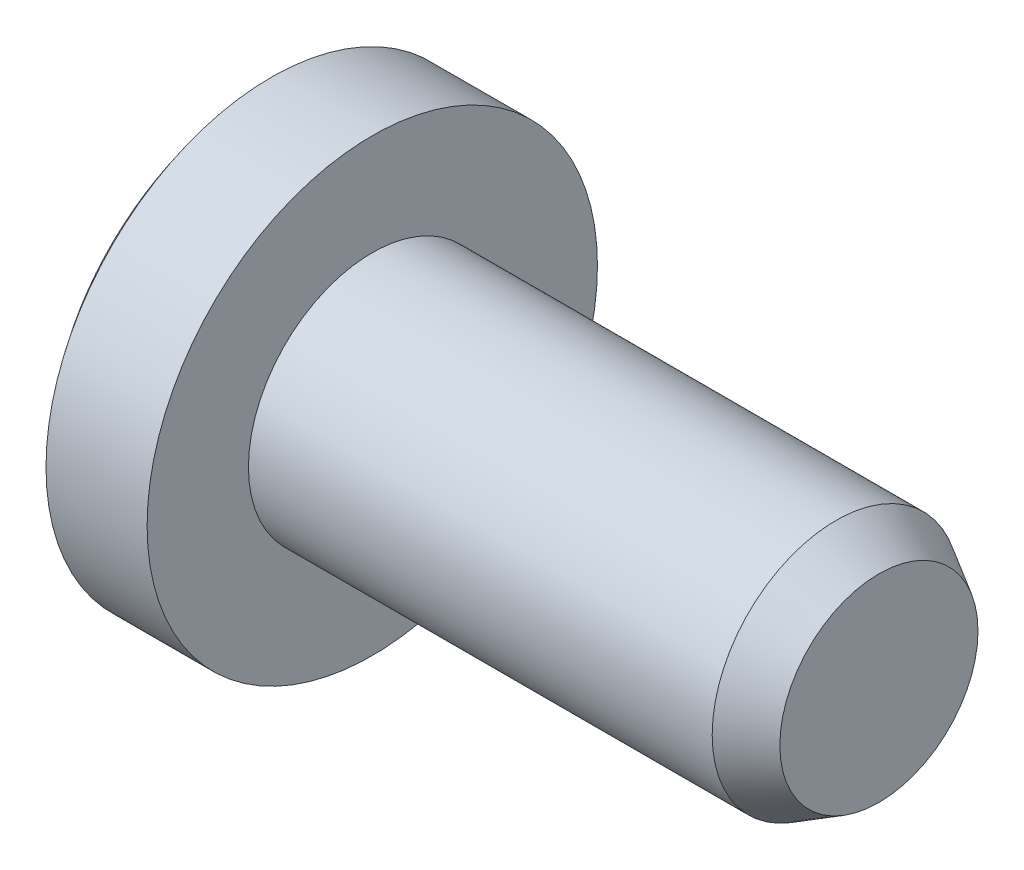
ISO-10303-21;
HEADER;
FILE_DESCRIPTION(('STEP AP214'),'2;1');
FILE_NAME('part.step','',(''),(''),'','','');
FILE_SCHEMA(('AUTOMOTIVE_DESIGN { 1 0 10303 214 1 1 1 1 }'));
ENDSEC;
DATA;
#1=APPLICATION_CONTEXT('core data for automotive mechanical design processes');
#2=APPLICATION_PROTOCOL_DEFINITION('international standard','automotive_design',2000,#1);
#3=PRODUCT_CONTEXT('',#1,'mechanical');
#4=PRODUCT('Part','Part','',(#3));
#5=PRODUCT_RELATED_PRODUCT_CATEGORY('part','',(#4));
#6=PRODUCT_DEFINITION_FORMATION('','',#4);
#7=PRODUCT_DEFINITION_CONTEXT('part definition',#1,'design');
#8=PRODUCT_DEFINITION('design','',#6,#7);
#9=PRODUCT_DEFINITION_SHAPE('','',#8);
#10=(LENGTH_UNIT() NAMED_UNIT(*) SI_UNIT(.MILLI.,.METRE.));
#11=(NAMED_UNIT(*) PLANE_ANGLE_UNIT() SI_UNIT($,.RADIAN.));
#12=(NAMED_UNIT(*) SI_UNIT($,.STERADIAN.) SOLID_ANGLE_UNIT());
#13=UNCERTAINTY_MEASURE_WITH_UNIT(LENGTH_MEASURE(1.E-05),#10,'distance_accuracy_value','');
#14=(GEOMETRIC_REPRESENTATION_CONTEXT(3) GLOBAL_UNCERTAINTY_ASSIGNED_CONTEXT((#13)) GLOBAL_UNIT_ASSIGNED_CONTEXT((#10,
#11,#12)) REPRESENTATION_CONTEXT('',''));
#15=CARTESIAN_POINT('',(0.,0.,0.));
#16=DIRECTION('',(0.,0.,1.));
#17=DIRECTION('',(1.,0.,0.));
#18=AXIS2_PLACEMENT_3D('',#15,#16,#17);
#19=CARTESIAN_POINT('',(1.6,0.,0.));
#20=DIRECTION('',(-1.,0.,0.));
#21=DIRECTION('',(0.,1.,0.));
#22=AXIS2_PLACEMENT_3D('',#19,#20,#21);
#23=SPHERICAL_SURFACE('',#22,3.2);
#24=CARTESIAN_POINT('',(-0.89799919935936,0.,0.));
#25=DIRECTION('',(-1.,0.,0.));
#26=DIRECTION('',(0.,0.,1.));
#27=AXIS2_PLACEMENT_3D('',#24,#25,#26);
#28=CIRCLE('',#27,2.);
#29=CARTESIAN_POINT('',(-0.89799919935936,0.,2.));
#30=VERTEX_POINT('',#29);
#31=EDGE_CURVE('E190',#30,#30,#28,.T.);
#32=ORIENTED_EDGE('',*,*,#31,.T.);
#33=EDGE_LOOP('',(#32));
#34=FACE_BOUND('',#33,.T.);
#35=CARTESIAN_POINT('',(1.56503616117409,0.0806815870157537,0.322726348063015));
#36=DIRECTION('',(0.104528463267654,-0.241206989505462,-0.964827958021851));
#37=DIRECTION('',(0.,0.970142500145332,-0.242535625036333));
#38=AXIS2_PLACEMENT_3D('',#35,#36,#37);
#39=CIRCLE('',#38,3.18247006517848);
#40=CARTESIAN_POINT('',(-1.45274996309991,0.934523397478773,-0.217677932639515));
#41=VERTEX_POINT('',#40);
#42=CARTESIAN_POINT('',(-1.54602165644221,0.569150220513997,-0.136439597205102));
#43=VERTEX_POINT('',#42);
#44=EDGE_CURVE('E11',#41,#43,#39,.F.);
#45=ORIENTED_EDGE('',*,*,#44,.F.);
#46=CARTESIAN_POINT('',(1.66379421431252,0.606961405040141,0.));
#47=DIRECTION('',(0.104528463267654,0.994521895368273,0.));
#48=DIRECTION('',(-0.994521895368273,0.104528463267654,0.));
#49=AXIS2_PLACEMENT_3D('',#46,#47,#48);
#50=CIRCLE('',#49,3.14126219074625);
#51=CARTESIAN_POINT('',(-1.45274996309991,0.934523397478773,0.217677932639514));
#52=VERTEX_POINT('',#51);
#53=EDGE_CURVE('E42',#52,#41,#50,.F.);
#54=ORIENTED_EDGE('',*,*,#53,.F.);
#55=CARTESIAN_POINT('',(1.56503616117409,0.0806815870157537,-0.322726348063015));
#56=DIRECTION('',(0.104528463267654,-0.241206989505462,0.964827958021851));
#57=DIRECTION('',(0.,-0.970142500145332,-0.242535625036333));
#58=AXIS2_PLACEMENT_3D('',#55,#56,#57);
#59=CIRCLE('',#58,3.18247006517848);
#60=CARTESIAN_POINT('',(-1.54602165644221,0.569150220513997,0.136439597205102));
#61=VERTEX_POINT('',#60);
#62=EDGE_CURVE('E326',#61,#52,#59,.F.);
#63=ORIENTED_EDGE('',*,*,#62,.F.);
#64=CARTESIAN_POINT('',(1.60749262454255,0.0356437803082174,0.061736838467657));
#65=DIRECTION('',(0.104528463267654,0.497260947684129,0.861281226008779));
#66=DIRECTION('',(0.,-0.866025403784443,0.499999999999992));
#67=AXIS2_PLACEMENT_3D('',#64,#65,#66);
#68=CIRCLE('',#67,3.19919707806175);
#69=CARTESIAN_POINT('',(-1.57234339721419,0.296847915734236,0.296847915734238));
#70=VERTEX_POINT('',#69);
#71=EDGE_CURVE('E324',#70,#61,#68,.F.);
#72=ORIENTED_EDGE('',*,*,#71,.F.);
#73=CARTESIAN_POINT('',(1.60749262454255,0.061736838467655,0.0356437803082149));
#74=DIRECTION('',(0.104528463267654,0.861281226008787,0.497260947684114));
#75=DIRECTION('',(0.,-0.499999999999977,0.866025403784452));
#76=AXIS2_PLACEMENT_3D('',#73,#74,#75);
#77=CIRCLE('',#76,3.19919707806175);
#78=CARTESIAN_POINT('',(-1.54602165644221,0.136439597205108,0.569150220513995));
#79=VERTEX_POINT('',#78);
#80=EDGE_CURVE('E322',#79,#70,#77,.F.);
#81=ORIENTED_EDGE('',*,*,#80,.F.);
#82=CARTESIAN_POINT('',(1.56503616117409,-0.322726348063014,0.0806815870157571));
#83=DIRECTION('',(0.104528463267654,0.964827958021848,-0.241206989505473));
#84=DIRECTION('',(0.,0.242535625036343,0.970142500145329));
#85=AXIS2_PLACEMENT_3D('',#82,#83,#84);
#86=CIRCLE('',#85,3.18247006517848);
#87=CARTESIAN_POINT('',(-1.45274996309991,0.217677932639524,0.934523397478771));
#88=VERTEX_POINT('',#87);
#89=EDGE_CURVE('E320',#88,#79,#86,.F.);
#90=ORIENTED_EDGE('',*,*,#89,.F.);
#91=CARTESIAN_POINT('',(1.66379421431252,0.,0.606961405040141));
#92=DIRECTION('',(0.104528463267654,0.,0.994521895368273));
#93=DIRECTION('',(0.994521895368273,0.,-0.104528463267654));
#94=AXIS2_PLACEMENT_3D('',#91,#92,#93);
#95=CIRCLE('',#94,3.14126219074625);
#96=CARTESIAN_POINT('',(-1.45274996309991,-0.217677932639505,0.934523397478775));
#97=VERTEX_POINT('',#96);
#98=EDGE_CURVE('E318',#97,#88,#95,.F.);
#99=ORIENTED_EDGE('',*,*,#98,.F.);
#100=CARTESIAN_POINT('',(1.56503616117409,0.322726348063016,0.0806815870157503));
#101=DIRECTION('',(0.104528463267654,-0.964827958021853,-0.241206989505452));
#102=DIRECTION('',(0.,0.242535625036323,-0.970142500145334));
#103=AXIS2_PLACEMENT_3D('',#100,#101,#102);
#104=CIRCLE('',#103,3.18247006517848);
#105=CARTESIAN_POINT('',(-1.54602165644221,-0.136439597205096,0.569150220513998));
#106=VERTEX_POINT('',#105);
#107=EDGE_CURVE('E316',#106,#97,#104,.F.);
#108=ORIENTED_EDGE('',*,*,#107,.F.);
#109=CARTESIAN_POINT('',(1.60749262454255,-0.0617368384676559,0.0356437803082175));
#110=DIRECTION('',(0.104528463267654,-0.861281226008775,0.497260947684136));
#111=DIRECTION('',(0.,-0.499999999999999,-0.866025403784439));
#112=AXIS2_PLACEMENT_3D('',#109,#110,#111);
#113=CIRCLE('',#112,3.19919707806175);
#114=CARTESIAN_POINT('',(-1.57234339721419,-0.296847915734233,0.296847915734241));
#115=VERTEX_POINT('',#114);
#116=EDGE_CURVE('E314',#115,#106,#113,.F.);
#117=ORIENTED_EDGE('',*,*,#116,.F.);
#118=CARTESIAN_POINT('',(1.60749262454255,-0.035643780308217,0.0617368384676573));
#119=DIRECTION('',(0.104528463267654,-0.497260947684123,0.861281226008782));
#120=DIRECTION('',(0.,-0.866025403784447,-0.499999999999986));
#121=AXIS2_PLACEMENT_3D('',#118,#119,#120);
#122=CIRCLE('',#121,3.19919707806175);
#123=CARTESIAN_POINT('',(-1.54602165644221,-0.569150220513996,0.136439597205106));
#124=VERTEX_POINT('',#123);
#125=EDGE_CURVE('E312',#124,#115,#122,.F.);
#126=ORIENTED_EDGE('',*,*,#125,.F.);
#127=CARTESIAN_POINT('',(1.56503616117409,-0.0806815870157559,-0.322726348063015));
#128=DIRECTION('',(0.104528463267654,0.241206989505469,0.964827958021849));
#129=DIRECTION('',(0.,-0.97014250014533,0.242535625036339));
#130=AXIS2_PLACEMENT_3D('',#127,#128,#129);
#131=CIRCLE('',#130,3.18247006517848);
#132=CARTESIAN_POINT('',(-1.45274996309991,-0.934523397478772,0.217677932639521));
#133=VERTEX_POINT('',#132);
#134=EDGE_CURVE('E310',#133,#124,#131,.F.);
#135=ORIENTED_EDGE('',*,*,#134,.F.);
#136=CARTESIAN_POINT('',(1.66379421431252,-0.606961405040141,0.));
#137=DIRECTION('',(0.104528463267654,-0.994521895368273,0.));
#138=DIRECTION('',(0.994521895368273,0.104528463267654,0.));
#139=AXIS2_PLACEMENT_3D('',#136,#137,#138);
#140=CIRCLE('',#139,3.14126219074625);
#141=CARTESIAN_POINT('',(-1.45274996309991,-0.934523397478775,-0.217677932639508));
#142=VERTEX_POINT('',#141);
#143=EDGE_CURVE('E308',#142,#133,#140,.F.);
#144=ORIENTED_EDGE('',*,*,#143,.F.);
#145=CARTESIAN_POINT('',(1.56503616117409,-0.0806815870157514,0.322726348063016));
#146=DIRECTION('',(0.104528463267654,0.241206989505456,-0.964827958021853));
#147=DIRECTION('',(0.,0.970142500145334,0.242535625036326));
#148=AXIS2_PLACEMENT_3D('',#145,#146,#147);
#149=CIRCLE('',#148,3.18247006517848);
#150=CARTESIAN_POINT('',(-1.54602165644221,-0.569150220513998,-0.136439597205098));
#151=VERTEX_POINT('',#150);
#152=EDGE_CURVE('E306',#151,#142,#149,.F.);
#153=ORIENTED_EDGE('',*,*,#152,.F.);
#154=CARTESIAN_POINT('',(1.60749262454255,-0.0356437803082211,-0.0617368384676606));
#155=DIRECTION('',(0.104528463267654,-0.497260947684145,-0.861281226008769));
#156=DIRECTION('',(0.,0.866025403784434,-0.500000000000008));
#157=AXIS2_PLACEMENT_3D('',#154,#155,#156);
#158=CIRCLE('',#157,3.19919707806175);
#159=CARTESIAN_POINT('',(-1.57234339721419,-0.296847915734241,-0.296847915734238));
#160=VERTEX_POINT('',#159);
#161=EDGE_CURVE('E304',#160,#151,#158,.F.);
#162=ORIENTED_EDGE('',*,*,#161,.F.);
#163=CARTESIAN_POINT('',(1.60749262454255,-0.061736838467661,-0.0356437803082204));
#164=DIRECTION('',(0.104528463267654,-0.861281226008775,-0.497260947684136));
#165=DIRECTION('',(0.,0.499999999999999,-0.866025403784439));
#166=AXIS2_PLACEMENT_3D('',#163,#164,#165);
#167=CIRCLE('',#166,3.19919707806175);
#168=CARTESIAN_POINT('',(-1.54602165644221,-0.136439597205104,-0.569150220513996));
#169=VERTEX_POINT('',#168);
#170=EDGE_CURVE('E302',#169,#160,#167,.F.);
#171=ORIENTED_EDGE('',*,*,#170,.F.);
#172=CARTESIAN_POINT('',(1.56503616117409,0.322726348063015,-0.0806815870157548));
#173=DIRECTION('',(0.104528463267654,-0.96482795802185,0.241206989505466));
#174=DIRECTION('',(0.,-0.242535625036336,-0.970142500145331));
#175=AXIS2_PLACEMENT_3D('',#172,#173,#174);
#176=CIRCLE('',#175,3.18247006517848);
#177=CARTESIAN_POINT('',(-1.45274996309991,-0.217677932639518,-0.934523397478772));
#178=VERTEX_POINT('',#177);
#179=EDGE_CURVE('E300',#178,#169,#176,.F.);
#180=ORIENTED_EDGE('',*,*,#179,.F.);
#181=CARTESIAN_POINT('',(1.66379421431252,0.,-0.606961405040141));
#182=DIRECTION('',(0.104528463267654,0.,-0.994521895368273));
#183=DIRECTION('',(-0.994521895368273,0.,-0.104528463267654));
#184=AXIS2_PLACEMENT_3D('',#181,#182,#183);
#185=CIRCLE('',#184,3.14126219074625);
#186=CARTESIAN_POINT('',(-1.45274996309991,0.217677932639511,-0.934523397478774));
#187=VERTEX_POINT('',#186);
#188=EDGE_CURVE('E298',#187,#178,#185,.F.);
#189=ORIENTED_EDGE('',*,*,#188,.F.);
#190=CARTESIAN_POINT('',(1.56503616117409,-0.322726348063015,-0.0806815870157525));
#191=DIRECTION('',(0.104528463267654,0.964827958021852,0.241206989505459));
#192=DIRECTION('',(0.,-0.242535625036329,0.970142500145333));
#193=AXIS2_PLACEMENT_3D('',#190,#191,#192);
#194=CIRCLE('',#193,3.18247006517848);
#195=CARTESIAN_POINT('',(-1.54602165644221,0.1364395972051,-0.569150220513997));
#196=VERTEX_POINT('',#195);
#197=EDGE_CURVE('E296',#196,#187,#194,.F.);
#198=ORIENTED_EDGE('',*,*,#197,.F.);
#199=CARTESIAN_POINT('',(1.60749262454255,0.0617368384676561,-0.035643780308217));
#200=DIRECTION('',(0.104528463267654,0.861281226008778,-0.497260947684129));
#201=DIRECTION('',(0.,0.499999999999993,0.866025403784443));
#202=AXIS2_PLACEMENT_3D('',#199,#200,#201);
#203=CIRCLE('',#202,3.19919707806175);
#204=CARTESIAN_POINT('',(-1.57234339721419,0.296847915734236,-0.296847915734239));
#205=VERTEX_POINT('',#204);
#206=EDGE_CURVE('E294',#205,#196,#203,.F.);
#207=ORIENTED_EDGE('',*,*,#206,.F.);
#208=CARTESIAN_POINT('',(1.60749262454255,0.0356437803082174,-0.061736838467657));
#209=DIRECTION('',(0.104528463267654,0.497260947684129,-0.861281226008779));
#210=DIRECTION('',(0.,0.866025403784443,0.499999999999992));
#211=AXIS2_PLACEMENT_3D('',#208,#209,#210);
#212=CIRCLE('',#211,3.19919707806175);
#213=EDGE_CURVE('E292',#43,#205,#212,.F.);
#214=ORIENTED_EDGE('',*,*,#213,.F.);
#215=EDGE_LOOP('',(#45,#54,#63,#72,#81,#90,#99,#108,#117,#126,#135,#144,#153,#162,#171,#180,
#189,#198,#207,#214));
#216=FACE_BOUND('',#215,.T.);
#217=ADVANCED_FACE('F34',(#34,#216),#23,.T.);
#218=CARTESIAN_POINT('',(0.,1.1,0.));
#219=DIRECTION('',(-1.,0.,0.));
#220=DIRECTION('',(0.,0.,1.));
#221=AXIS2_PLACEMENT_3D('',#218,#219,#220);
#222=PLANE('',#221);
#223=CARTESIAN_POINT('',(0.,0.,0.));
#224=DIRECTION('',(-1.,0.,0.));
#225=DIRECTION('',(0.,0.,1.));
#226=AXIS2_PLACEMENT_3D('',#223,#224,#225);
#227=CIRCLE('',#226,2.);
#228=CARTESIAN_POINT('',(0.,0.,2.));
#229=VERTEX_POINT('',#228);
#230=EDGE_CURVE('E283',#229,#229,#227,.T.);
#231=ORIENTED_EDGE('',*,*,#230,.F.);
#232=EDGE_LOOP('',(#231));
#233=FACE_BOUND('',#232,.T.);
#234=CARTESIAN_POINT('',(0.,0.,0.));
#235=DIRECTION('',(-1.,0.,0.));
#236=DIRECTION('',(0.,0.,1.));
#237=AXIS2_PLACEMENT_3D('',#234,#235,#236);
#238=CIRCLE('',#237,1.1);
#239=CARTESIAN_POINT('',(0.,0.,1.1));
#240=VERTEX_POINT('',#239);
#241=EDGE_CURVE('E186',#240,#240,#238,.T.);
#242=ORIENTED_EDGE('',*,*,#241,.T.);
#243=EDGE_LOOP('',(#242));
#244=FACE_BOUND('',#243,.T.);
#245=ADVANCED_FACE('F422',(#233,#244),#222,.F.);
#246=CARTESIAN_POINT('',(0.,0.,0.));
#247=DIRECTION('',(-1.,0.,0.));
#248=DIRECTION('',(0.,0.,1.));
#249=AXIS2_PLACEMENT_3D('',#246,#247,#248);
#250=CYLINDRICAL_SURFACE('',#249,2.);
#251=ORIENTED_EDGE('',*,*,#31,.F.);
#252=EDGE_LOOP('',(#251));
#253=FACE_BOUND('',#252,.T.);
#254=ORIENTED_EDGE('',*,*,#230,.T.);
#255=EDGE_LOOP('',(#254));
#256=FACE_BOUND('',#255,.T.);
#257=ADVANCED_FACE('F428',(#253,#256),#250,.T.);
#258=CARTESIAN_POINT('',(4.5,1.1,0.));
#259=DIRECTION('',(-1.,0.,0.));
#260=DIRECTION('',(0.,0.,1.));
#261=AXIS2_PLACEMENT_3D('',#258,#259,#260);
#262=PLANE('',#261);
#263=CARTESIAN_POINT('',(4.5,0.,0.));
#264=DIRECTION('',(-1.,0.,0.));
#265=DIRECTION('',(0.,0.,1.));
#266=AXIS2_PLACEMENT_3D('',#263,#264,#265);
#267=CIRCLE('',#266,0.88);
#268=CARTESIAN_POINT('',(4.5,0.,0.88));
#269=VERTEX_POINT('',#268);
#270=EDGE_CURVE('E289',#269,#269,#267,.F.);
#271=ORIENTED_EDGE('',*,*,#270,.T.);
#272=EDGE_LOOP('',(#271));
#273=FACE_BOUND('',#272,.T.);
#274=ADVANCED_FACE('F432',(#273),#262,.F.);
#275=CARTESIAN_POINT('',(0.,0.,0.));
#276=DIRECTION('',(-1.,0.,0.));
#277=DIRECTION('',(0.,0.,1.));
#278=AXIS2_PLACEMENT_3D('',#275,#276,#277);
#279=CYLINDRICAL_SURFACE('',#278,1.1);
#280=CARTESIAN_POINT('',(4.11894882233485,0.,0.));
#281=DIRECTION('',(-1.,0.,0.));
#282=DIRECTION('',(0.,0.,1.));
#283=AXIS2_PLACEMENT_3D('',#280,#281,#282);
#284=CIRCLE('',#283,1.1);
#285=CARTESIAN_POINT('',(4.11894882233485,0.,1.1));
#286=VERTEX_POINT('',#285);
#287=EDGE_CURVE('E286',#286,#286,#284,.T.);
#288=ORIENTED_EDGE('',*,*,#287,.T.);
#289=EDGE_LOOP('',(#288));
#290=FACE_BOUND('',#289,.T.);
#291=ORIENTED_EDGE('',*,*,#241,.F.);
#292=EDGE_LOOP('',(#291));
#293=FACE_BOUND('',#292,.T.);
#294=ADVANCED_FACE('F439',(#290,#293),#279,.T.);
#295=CARTESIAN_POINT('',(4.11894882233485,0.,0.));
#296=DIRECTION('',(-1.,0.,0.));
#297=DIRECTION('',(0.,0.,1.));
#298=AXIS2_PLACEMENT_3D('',#295,#296,#297);
#299=CONICAL_SURFACE('',#298,1.1,0.523598775598301);
#300=ORIENTED_EDGE('',*,*,#270,.F.);
#301=EDGE_LOOP('',(#300));
#302=FACE_BOUND('',#301,.T.);
#303=ORIENTED_EDGE('',*,*,#287,.F.);
#304=EDGE_LOOP('',(#303));
#305=FACE_BOUND('',#304,.T.);
#306=ADVANCED_FACE('F36',(#302,#305),#299,.T.);
#307=CARTESIAN_POINT('',(-1.6,0.95,-0.2375));
#308=DIRECTION('',(0.104528463267654,-0.241206989505462,-0.964827958021851));
#309=DIRECTION('',(0.,0.970142500145332,-0.242535625036333));
#310=AXIS2_PLACEMENT_3D('',#307,#308,#309);
#311=PLANE('',#310);
#312=ORIENTED_EDGE('',*,*,#44,.T.);
#313=DIRECTION('',(-0.993634572314887,0.0156427600493606,-0.111560032084303));
#314=VECTOR('',#313,1.);
#315=CARTESIAN_POINT('',(-1.6,0.57,-0.1425));
#316=LINE('',#315,#314);
#317=CARTESIAN_POINT('',(-0.8,0.557405623366814,-0.052680233101673));
#318=VERTEX_POINT('',#317);
#319=EDGE_CURVE('E49',#318,#43,#316,.T.);
#320=ORIENTED_EDGE('',*,*,#319,.F.);
#321=DIRECTION('',(0.,-0.970142500145332,0.242535625036333));
#322=VECTOR('',#321,1.);
#323=CARTESIAN_POINT('',(-0.8,0.0203932171153007,0.081572868461205));
#324=LINE('',#323,#322);
#325=CARTESIAN_POINT('',(-0.8,0.865916611787458,-0.129807980206834));
#326=VERTEX_POINT('',#325);
#327=EDGE_CURVE('E175',#318,#326,#324,.F.);
#328=ORIENTED_EDGE('',*,*,#327,.T.);
#329=DIRECTION('',(-0.985727427293419,0.103604127426078,-0.132693722013437));
#330=VECTOR('',#329,1.);
#331=CARTESIAN_POINT('',(-1.53787007542131,0.943469881790042,-0.229136378665655));
#332=LINE('',#331,#330);
#333=EDGE_CURVE('E182',#326,#41,#332,.T.);
#334=ORIENTED_EDGE('',*,*,#333,.T.);
#335=EDGE_LOOP('',(#312,#320,#328,#334));
#336=FACE_BOUND('',#335,.T.);
#337=ADVANCED_FACE('F181',(#336),#311,.F.);
#338=CARTESIAN_POINT('',(-1.6,0.95,0.2375));
#339=DIRECTION('',(0.104528463267654,0.994521895368273,0.));
#340=DIRECTION('',(-0.994521895368273,0.104528463267654,0.));
#341=AXIS2_PLACEMENT_3D('',#338,#339,#340);
#342=PLANE('',#341);
#343=ORIENTED_EDGE('',*,*,#53,.T.);
#344=ORIENTED_EDGE('',*,*,#333,.F.);
#345=DIRECTION('',(0.,0.,-1.));
#346=VECTOR('',#345,1.);
#347=CARTESIAN_POINT('',(-0.8,0.865916611787458,0.));
#348=LINE('',#347,#346);
#349=CARTESIAN_POINT('',(-0.8,0.865916611787458,0.129807980206834));
#350=VERTEX_POINT('',#349);
#351=EDGE_CURVE('E171',#326,#350,#348,.F.);
#352=ORIENTED_EDGE('',*,*,#351,.T.);
#353=DIRECTION('',(-0.985727427293419,0.103604127426078,0.132693722013437));
#354=VECTOR('',#353,1.);
#355=CARTESIAN_POINT('',(-1.6,0.95,0.2375));
#356=LINE('',#355,#354);
#357=EDGE_CURVE('E187',#350,#52,#356,.T.);
#358=ORIENTED_EDGE('',*,*,#357,.T.);
#359=EDGE_LOOP('',(#343,#344,#352,#358));
#360=FACE_BOUND('',#359,.T.);
#361=ADVANCED_FACE('F185',(#360),#342,.F.);
#362=CARTESIAN_POINT('',(-1.6,0.95,0.2375));
#363=DIRECTION('',(0.104528463267654,-0.241206989505462,0.964827958021851));
#364=DIRECTION('',(0.,-0.970142500145332,-0.242535625036333));
#365=AXIS2_PLACEMENT_3D('',#362,#363,#364);
#366=PLANE('',#365);
#367=ORIENTED_EDGE('',*,*,#62,.T.);
#368=ORIENTED_EDGE('',*,*,#357,.F.);
#369=DIRECTION('',(0.,0.970142500145332,0.242535625036333));
#370=VECTOR('',#369,1.);
#371=CARTESIAN_POINT('',(-0.8,0.0203932171153005,-0.0815728684612051));
#372=LINE('',#371,#370);
#373=CARTESIAN_POINT('',(-0.8,0.557405623366814,0.052680233101673));
#374=VERTEX_POINT('',#373);
#375=EDGE_CURVE('E177',#350,#374,#372,.F.);
#376=ORIENTED_EDGE('',*,*,#375,.T.);
#377=DIRECTION('',(-0.993634572314887,0.0156427600493605,0.111560032084303));
#378=VECTOR('',#377,1.);
#379=CARTESIAN_POINT('',(-1.61643715208567,0.57025876960518,0.14434547646101));
#380=LINE('',#379,#378);
#381=EDGE_CURVE('E192',#374,#61,#380,.T.);
#382=ORIENTED_EDGE('',*,*,#381,.T.);
#383=EDGE_LOOP('',(#367,#368,#376,#382));
#384=FACE_BOUND('',#383,.T.);
#385=ADVANCED_FACE('F329',(#384),#366,.F.);
#386=CARTESIAN_POINT('',(-1.6,0.57,0.1425));
#387=DIRECTION('',(0.104528463267654,0.497260947684129,0.861281226008779));
#388=DIRECTION('',(0.,-0.866025403784443,0.499999999999992));
#389=AXIS2_PLACEMENT_3D('',#386,#387,#388);
#390=PLANE('',#389);
#391=ORIENTED_EDGE('',*,*,#71,.T.);
#392=ORIENTED_EDGE('',*,*,#381,.F.);
#393=DIRECTION('',(0.,0.866025403784443,-0.499999999999992));
#394=VECTOR('',#393,1.);
#395=CARTESIAN_POINT('',(-0.8,0.162162615913366,0.280873889850233));
#396=LINE('',#395,#394);
#397=CARTESIAN_POINT('',(-0.8,0.237422547873724,0.237422547873728));
#398=VERTEX_POINT('',#397);
#399=EDGE_CURVE('E248',#374,#398,#396,.F.);
#400=ORIENTED_EDGE('',*,*,#399,.T.);
#401=DIRECTION('',(-0.994132040497618,0.0764901498757915,0.0764901498757902));
#402=VECTOR('',#401,1.);
#403=CARTESIAN_POINT('',(-1.60871040111109,0.299646052667046,0.299646052667049));
#404=LINE('',#403,#402);
#405=EDGE_CURVE('E242',#398,#70,#404,.T.);
#406=ORIENTED_EDGE('',*,*,#405,.T.);
#407=EDGE_LOOP('',(#391,#392,#400,#406));
#408=FACE_BOUND('',#407,.T.);
#409=ADVANCED_FACE('F412',(#408),#390,.F.);
#410=CARTESIAN_POINT('',(-1.6,0.142500000000006,0.569999999999998));
#411=DIRECTION('',(0.104528463267654,0.861281226008787,0.497260947684114));
#412=DIRECTION('',(0.,-0.499999999999977,0.866025403784452));
#413=AXIS2_PLACEMENT_3D('',#410,#411,#412);
#414=PLANE('',#413);
#415=ORIENTED_EDGE('',*,*,#80,.T.);
#416=ORIENTED_EDGE('',*,*,#405,.F.);
#417=DIRECTION('',(0.,0.499999999999977,-0.866025403784452));
#418=VECTOR('',#417,1.);
#419=CARTESIAN_POINT('',(-0.8,0.280873889850234,0.16216261591336));
#420=LINE('',#419,#418);
#421=CARTESIAN_POINT('',(-0.8,0.0526802331016789,0.557405623366813));
#422=VERTEX_POINT('',#421);
#423=EDGE_CURVE('E250',#398,#422,#420,.F.);
#424=ORIENTED_EDGE('',*,*,#423,.T.);
#425=DIRECTION('',(-0.993634572314886,0.111560032084303,0.015642760049359));
#426=VECTOR('',#425,1.);
#427=CARTESIAN_POINT('',(-1.6,0.142500000000006,0.569999999999998));
#428=LINE('',#427,#426);
#429=EDGE_CURVE('E239',#422,#79,#428,.T.);
#430=ORIENTED_EDGE('',*,*,#429,.T.);
#431=EDGE_LOOP('',(#415,#416,#424,#430));
#432=FACE_BOUND('',#431,.T.);
#433=ADVANCED_FACE('F409',(#432),#414,.F.);
#434=CARTESIAN_POINT('',(-1.6,0.23750000000001,0.949999999999997));
#435=DIRECTION('',(0.104528463267654,0.964827958021848,-0.241206989505473));
#436=DIRECTION('',(0.,0.242535625036343,0.970142500145329));
#437=AXIS2_PLACEMENT_3D('',#434,#435,#436);
#438=PLANE('',#437);
#439=ORIENTED_EDGE('',*,*,#89,.T.);
#440=ORIENTED_EDGE('',*,*,#429,.F.);
#441=DIRECTION('',(0.,-0.242535625036343,-0.970142500145329));
#442=VECTOR('',#441,1.);
#443=CARTESIAN_POINT('',(-0.8,-0.0815728684612048,0.0203932171153015));
#444=LINE('',#443,#442);
#445=CARTESIAN_POINT('',(-0.8,0.129807980206843,0.865916611787457));
#446=VERTEX_POINT('',#445);
#447=EDGE_CURVE('E252',#422,#446,#444,.F.);
#448=ORIENTED_EDGE('',*,*,#447,.T.);
#449=DIRECTION('',(-0.985727427293419,0.132693722013438,0.103604127426076));
#450=VECTOR('',#449,1.);
#451=CARTESIAN_POINT('',(-1.53787007542131,0.229136378665665,0.94346988179004));
#452=LINE('',#451,#450);
#453=EDGE_CURVE('E236',#446,#88,#452,.T.);
#454=ORIENTED_EDGE('',*,*,#453,.T.);
#455=EDGE_LOOP('',(#439,#440,#448,#454));
#456=FACE_BOUND('',#455,.T.);
#457=ADVANCED_FACE('F406',(#456),#438,.F.);
#458=CARTESIAN_POINT('',(-1.6,-0.23749999999999,0.950000000000002));
#459=DIRECTION('',(0.104528463267654,0.,0.994521895368273));
#460=DIRECTION('',(0.994521895368273,0.,-0.104528463267654));
#461=AXIS2_PLACEMENT_3D('',#458,#459,#460);
#462=PLANE('',#461);
#463=ORIENTED_EDGE('',*,*,#98,.T.);
#464=ORIENTED_EDGE('',*,*,#453,.F.);
#465=DIRECTION('',(0.,1.,0.));
#466=VECTOR('',#465,1.);
#467=CARTESIAN_POINT('',(-0.8,0.,0.865916611787458));
#468=LINE('',#467,#466);
#469=CARTESIAN_POINT('',(-0.8,-0.129807980206825,0.86591661178746));
#470=VERTEX_POINT('',#469);
#471=EDGE_CURVE('E254',#446,#470,#468,.F.);
#472=ORIENTED_EDGE('',*,*,#471,.T.);
#473=DIRECTION('',(-0.985727427293419,-0.132693722013436,0.103604127426079));
#474=VECTOR('',#473,1.);
#475=CARTESIAN_POINT('',(-1.6,-0.23749999999999,0.950000000000002));
#476=LINE('',#475,#474);
#477=EDGE_CURVE('E233',#470,#97,#476,.T.);
#478=ORIENTED_EDGE('',*,*,#477,.T.);
#479=EDGE_LOOP('',(#463,#464,#472,#478));
#480=FACE_BOUND('',#479,.T.);
#481=ADVANCED_FACE('F399',(#480),#462,.F.);
#482=CARTESIAN_POINT('',(-1.6,-0.23749999999999,0.950000000000002));
#483=DIRECTION('',(0.104528463267654,-0.964827958021853,-0.241206989505452));
#484=DIRECTION('',(0.,0.242535625036323,-0.970142500145334));
#485=AXIS2_PLACEMENT_3D('',#482,#483,#484);
#486=PLANE('',#485);
#487=ORIENTED_EDGE('',*,*,#107,.T.);
#488=ORIENTED_EDGE('',*,*,#477,.F.);
#489=DIRECTION('',(0.,-0.242535625036323,0.970142500145334));
#490=VECTOR('',#489,1.);
#491=CARTESIAN_POINT('',(-0.8,0.0815728684612052,0.0203932171153001));
#492=LINE('',#491,#490);
#493=CARTESIAN_POINT('',(-0.8,-0.0526802331016672,0.557405623366814));
#494=VERTEX_POINT('',#493);
#495=EDGE_CURVE('E256',#470,#494,#492,.F.);
#496=ORIENTED_EDGE('',*,*,#495,.T.);
#497=DIRECTION('',(-0.993634572314887,-0.111560032084303,0.0156427600493616));
#498=VECTOR('',#497,1.);
#499=CARTESIAN_POINT('',(-1.61643715208567,-0.144345476461004,0.570258769605181));
#500=LINE('',#499,#498);
#501=EDGE_CURVE('E230',#494,#106,#500,.T.);
#502=ORIENTED_EDGE('',*,*,#501,.T.);
#503=EDGE_LOOP('',(#487,#488,#496,#502));
#504=FACE_BOUND('',#503,.T.);
#505=ADVANCED_FACE('F397',(#504),#486,.F.);
#506=CARTESIAN_POINT('',(-1.6,-0.142499999999994,0.570000000000001));
#507=DIRECTION('',(0.104528463267654,-0.861281226008775,0.497260947684136));
#508=DIRECTION('',(0.,-0.499999999999999,-0.866025403784439));
#509=AXIS2_PLACEMENT_3D('',#506,#507,#508);
#510=PLANE('',#509);
#511=ORIENTED_EDGE('',*,*,#116,.T.);
#512=ORIENTED_EDGE('',*,*,#501,.F.);
#513=DIRECTION('',(0.,0.499999999999999,0.866025403784439));
#514=VECTOR('',#513,1.);
#515=CARTESIAN_POINT('',(-0.8,-0.280873889850231,0.162162615913367));
#516=LINE('',#515,#514);
#517=CARTESIAN_POINT('',(-0.8,-0.237422547873723,0.23742254787373));
#518=VERTEX_POINT('',#517);
#519=EDGE_CURVE('E258',#494,#518,#516,.F.);
#520=ORIENTED_EDGE('',*,*,#519,.T.);
#521=DIRECTION('',(-0.994132040497618,-0.07649014987579,0.0764901498757912));
#522=VECTOR('',#521,1.);
#523=CARTESIAN_POINT('',(-1.60871040111109,-0.299646052667044,0.299646052667052));
#524=LINE('',#523,#522);
#525=EDGE_CURVE('E227',#518,#115,#524,.T.);
#526=ORIENTED_EDGE('',*,*,#525,.T.);
#527=EDGE_LOOP('',(#511,#512,#520,#526));
#528=FACE_BOUND('',#527,.T.);
#529=ADVANCED_FACE('F390',(#528),#510,.F.);
#530=CARTESIAN_POINT('',(-1.6,-0.569999999999999,0.142500000000004));
#531=DIRECTION('',(0.104528463267654,-0.497260947684123,0.861281226008782));
#532=DIRECTION('',(0.,-0.866025403784447,-0.499999999999986));
#533=AXIS2_PLACEMENT_3D('',#530,#531,#532);
#534=PLANE('',#533);
#535=ORIENTED_EDGE('',*,*,#125,.T.);
#536=ORIENTED_EDGE('',*,*,#525,.F.);
#537=DIRECTION('',(0.,0.866025403784447,0.499999999999986));
#538=VECTOR('',#537,1.);
#539=CARTESIAN_POINT('',(-0.8,-0.162162615913365,0.280873889850234));
#540=LINE('',#539,#538);
#541=CARTESIAN_POINT('',(-0.8,-0.557405623366813,0.0526802331016769));
#542=VERTEX_POINT('',#541);
#543=EDGE_CURVE('E260',#518,#542,#540,.F.);
#544=ORIENTED_EDGE('',*,*,#543,.T.);
#545=DIRECTION('',(-0.993634572314887,-0.0156427600493598,0.111560032084303));
#546=VECTOR('',#545,1.);
#547=CARTESIAN_POINT('',(-1.6,-0.569999999999999,0.142500000000004));
#548=LINE('',#547,#546);
#549=EDGE_CURVE('E224',#542,#124,#548,.T.);
#550=ORIENTED_EDGE('',*,*,#549,.T.);
#551=EDGE_LOOP('',(#535,#536,#544,#550));
#552=FACE_BOUND('',#551,.T.);
#553=ADVANCED_FACE('F387',(#552),#534,.F.);
#554=CARTESIAN_POINT('',(-1.6,-0.949999999999998,0.237500000000007));
#555=DIRECTION('',(0.104528463267654,0.241206989505469,0.964827958021849));
#556=DIRECTION('',(0.,-0.97014250014533,0.242535625036339));
#557=AXIS2_PLACEMENT_3D('',#554,#555,#556);
#558=PLANE('',#557);
#559=ORIENTED_EDGE('',*,*,#134,.T.);
#560=ORIENTED_EDGE('',*,*,#549,.F.);
#561=DIRECTION('',(0.,0.97014250014533,-0.242535625036339));
#562=VECTOR('',#561,1.);
#563=CARTESIAN_POINT('',(-0.8,-0.0203932171153022,-0.0815728684612047));
#564=LINE('',#563,#562);
#565=CARTESIAN_POINT('',(-0.8,-0.865916611787457,0.12980798020684));
#566=VERTEX_POINT('',#565);
#567=EDGE_CURVE('E262',#542,#566,#564,.F.);
#568=ORIENTED_EDGE('',*,*,#567,.T.);
#569=DIRECTION('',(-0.985727427293419,-0.103604127426077,0.132693722013438));
#570=VECTOR('',#569,1.);
#571=CARTESIAN_POINT('',(-1.53787007542131,-0.943469881790041,0.229136378665662));
#572=LINE('',#571,#570);
#573=EDGE_CURVE('E221',#566,#133,#572,.T.);
#574=ORIENTED_EDGE('',*,*,#573,.T.);
#575=EDGE_LOOP('',(#559,#560,#568,#574));
#576=FACE_BOUND('',#575,.T.);
#577=ADVANCED_FACE('F379',(#576),#558,.F.);
#578=CARTESIAN_POINT('',(-1.6,-0.950000000000001,-0.237499999999994));
#579=DIRECTION('',(0.104528463267654,-0.994521895368273,0.));
#580=DIRECTION('',(0.994521895368273,0.104528463267654,0.));
#581=AXIS2_PLACEMENT_3D('',#578,#579,#580);
#582=PLANE('',#581);
#583=ORIENTED_EDGE('',*,*,#143,.T.);
#584=ORIENTED_EDGE('',*,*,#573,.F.);
#585=DIRECTION('',(0.,0.,1.));
#586=VECTOR('',#585,1.);
#587=CARTESIAN_POINT('',(-0.8,-0.865916611787458,0.));
#588=LINE('',#587,#586);
#589=CARTESIAN_POINT('',(-0.8,-0.865916611787459,-0.129807980206828));
#590=VERTEX_POINT('',#589);
#591=EDGE_CURVE('E264',#566,#590,#588,.F.);
#592=ORIENTED_EDGE('',*,*,#591,.T.);
#593=DIRECTION('',(-0.985727427293419,-0.103604127426079,-0.132693722013436));
#594=VECTOR('',#593,1.);
#595=CARTESIAN_POINT('',(-1.6,-0.950000000000001,-0.237499999999994));
#596=LINE('',#595,#594);
#597=EDGE_CURVE('E218',#590,#142,#596,.T.);
#598=ORIENTED_EDGE('',*,*,#597,.T.);
#599=EDGE_LOOP('',(#583,#584,#592,#598));
#600=FACE_BOUND('',#599,.T.);
#601=ADVANCED_FACE('F377',(#600),#582,.F.);
#602=CARTESIAN_POINT('',(-1.6,-0.950000000000001,-0.237499999999994));
#603=DIRECTION('',(0.104528463267654,0.241206989505456,-0.964827958021853));
#604=DIRECTION('',(0.,0.970142500145334,0.242535625036326));
#605=AXIS2_PLACEMENT_3D('',#602,#603,#604);
#606=PLANE('',#605);
#607=ORIENTED_EDGE('',*,*,#152,.T.);
#608=ORIENTED_EDGE('',*,*,#597,.F.);
#609=DIRECTION('',(0.,-0.970142500145334,-0.242535625036326));
#610=VECTOR('',#609,1.);
#611=CARTESIAN_POINT('',(-0.8,-0.0203932171153013,0.0815728684612049));
#612=LINE('',#611,#610);
#613=CARTESIAN_POINT('',(-0.8,-0.557405623366813,-0.052680233101669));
#614=VERTEX_POINT('',#613);
#615=EDGE_CURVE('E266',#590,#614,#612,.F.);
#616=ORIENTED_EDGE('',*,*,#615,.T.);
#617=DIRECTION('',(-0.993634572314886,-0.015642760049362,-0.111560032084303));
#618=VECTOR('',#617,1.);
#619=CARTESIAN_POINT('',(-1.61643715208567,-0.570258769605181,-0.144345476461006));
#620=LINE('',#619,#618);
#621=EDGE_CURVE('E215',#614,#151,#620,.T.);
#622=ORIENTED_EDGE('',*,*,#621,.T.);
#623=EDGE_LOOP('',(#607,#608,#616,#622));
#624=FACE_BOUND('',#623,.T.);
#625=ADVANCED_FACE('F370',(#624),#606,.F.);
#626=CARTESIAN_POINT('',(-1.6,-0.570000000000001,-0.142499999999996));
#627=DIRECTION('',(0.104528463267654,-0.497260947684145,-0.861281226008769));
#628=DIRECTION('',(0.,0.866025403784434,-0.500000000000008));
#629=AXIS2_PLACEMENT_3D('',#626,#627,#628);
#630=PLANE('',#629);
#631=ORIENTED_EDGE('',*,*,#161,.T.);
#632=ORIENTED_EDGE('',*,*,#621,.F.);
#633=DIRECTION('',(0.,-0.866025403784434,0.500000000000008));
#634=VECTOR('',#633,1.);
#635=CARTESIAN_POINT('',(-0.8,-0.162162615913374,-0.280873889850234));
#636=LINE('',#635,#634);
#637=CARTESIAN_POINT('',(-0.8,-0.237422547873731,-0.237422547873729));
#638=VERTEX_POINT('',#637);
#639=EDGE_CURVE('E268',#614,#638,#636,.F.);
#640=ORIENTED_EDGE('',*,*,#639,.T.);
#641=DIRECTION('',(-0.994132040497618,-0.0764901498757907,-0.07649014987579));
#642=VECTOR('',#641,1.);
#643=CARTESIAN_POINT('',(-1.60871040111109,-0.299646052667052,-0.299646052667049));
#644=LINE('',#643,#642);
#645=EDGE_CURVE('E212',#638,#160,#644,.T.);
#646=ORIENTED_EDGE('',*,*,#645,.T.);
#647=EDGE_LOOP('',(#631,#632,#640,#646));
#648=FACE_BOUND('',#647,.T.);
#649=ADVANCED_FACE('F367',(#648),#630,.F.);
#650=CARTESIAN_POINT('',(-1.6,-0.142500000000002,-0.569999999999999));
#651=DIRECTION('',(0.104528463267654,-0.861281226008775,-0.497260947684136));
#652=DIRECTION('',(0.,0.499999999999999,-0.866025403784439));
#653=AXIS2_PLACEMENT_3D('',#650,#651,#652);
#654=PLANE('',#653);
#655=ORIENTED_EDGE('',*,*,#170,.T.);
#656=ORIENTED_EDGE('',*,*,#645,.F.);
#657=DIRECTION('',(0.,-0.499999999999999,0.866025403784439));
#658=VECTOR('',#657,1.);
#659=CARTESIAN_POINT('',(-0.8,-0.280873889850236,-0.162162615913371));
#660=LINE('',#659,#658);
#661=CARTESIAN_POINT('',(-0.8,-0.0526802331016748,-0.557405623366813));
#662=VERTEX_POINT('',#661);
#663=EDGE_CURVE('E270',#638,#662,#660,.F.);
#664=ORIENTED_EDGE('',*,*,#663,.T.);
#665=DIRECTION('',(-0.993634572314887,-0.111560032084303,-0.0156427600493608));
#666=VECTOR('',#665,1.);
#667=CARTESIAN_POINT('',(-1.6,-0.142500000000002,-0.569999999999999));
#668=LINE('',#667,#666);
#669=EDGE_CURVE('E209',#662,#169,#668,.T.);
#670=ORIENTED_EDGE('',*,*,#669,.T.);
#671=EDGE_LOOP('',(#655,#656,#664,#670));
#672=FACE_BOUND('',#671,.T.);
#673=ADVANCED_FACE('F359',(#672),#654,.F.);
#674=CARTESIAN_POINT('',(-1.6,-0.237500000000003,-0.949999999999999));
#675=DIRECTION('',(0.104528463267654,-0.96482795802185,0.241206989505466));
#676=DIRECTION('',(0.,-0.242535625036336,-0.970142500145331));
#677=AXIS2_PLACEMENT_3D('',#674,#675,#676);
#678=PLANE('',#677);
#679=ORIENTED_EDGE('',*,*,#179,.T.);
#680=ORIENTED_EDGE('',*,*,#669,.F.);
#681=DIRECTION('',(0.,0.242535625036336,0.970142500145331));
#682=VECTOR('',#681,1.);
#683=CARTESIAN_POINT('',(-0.8,0.0815728684612047,-0.020393217115302));
#684=LINE('',#683,#682);
#685=CARTESIAN_POINT('',(-0.8,-0.129807980206837,-0.865916611787458));
#686=VERTEX_POINT('',#685);
#687=EDGE_CURVE('E272',#662,#686,#684,.F.);
#688=ORIENTED_EDGE('',*,*,#687,.T.);
#689=DIRECTION('',(-0.985727427293419,-0.132693722013437,-0.103604127426077));
#690=VECTOR('',#689,1.);
#691=CARTESIAN_POINT('',(-1.53787007542131,-0.229136378665658,-0.943469881790042));
#692=LINE('',#691,#690);
#693=EDGE_CURVE('E206',#686,#178,#692,.T.);
#694=ORIENTED_EDGE('',*,*,#693,.T.);
#695=EDGE_LOOP('',(#679,#680,#688,#694));
#696=FACE_BOUND('',#695,.T.);
#697=ADVANCED_FACE('F357',(#696),#678,.F.);
#698=CARTESIAN_POINT('',(-1.6,0.237499999999997,-0.950000000000001));
#699=DIRECTION('',(0.104528463267654,0.,-0.994521895368273));
#700=DIRECTION('',(-0.994521895368273,0.,-0.104528463267654));
#701=AXIS2_PLACEMENT_3D('',#698,#699,#700);
#702=PLANE('',#701);
#703=ORIENTED_EDGE('',*,*,#188,.T.);
#704=ORIENTED_EDGE('',*,*,#693,.F.);
#705=DIRECTION('',(0.,-1.,0.));
#706=VECTOR('',#705,1.);
#707=CARTESIAN_POINT('',(-0.8,0.,-0.865916611787458));
#708=LINE('',#707,#706);
#709=CARTESIAN_POINT('',(-0.8,0.129807980206831,-0.865916611787459));
#710=VERTEX_POINT('',#709);
#711=EDGE_CURVE('E274',#686,#710,#708,.F.);
#712=ORIENTED_EDGE('',*,*,#711,.T.);
#713=DIRECTION('',(-0.985727427293418,0.132693722013436,-0.103604127426078));
#714=VECTOR('',#713,1.);
#715=CARTESIAN_POINT('',(-1.6,0.237499999999997,-0.950000000000001));
#716=LINE('',#715,#714);
#717=EDGE_CURVE('E203',#710,#187,#716,.T.);
#718=ORIENTED_EDGE('',*,*,#717,.T.);
#719=EDGE_LOOP('',(#703,#704,#712,#718));
#720=FACE_BOUND('',#719,.T.);
#721=ADVANCED_FACE('F350',(#720),#702,.F.);
#722=CARTESIAN_POINT('',(-1.6,0.237499999999997,-0.950000000000001));
#723=DIRECTION('',(0.104528463267654,0.964827958021852,0.241206989505459));
#724=DIRECTION('',(0.,-0.242535625036329,0.970142500145333));
#725=AXIS2_PLACEMENT_3D('',#722,#723,#724);
#726=PLANE('',#725);
#727=ORIENTED_EDGE('',*,*,#197,.T.);
#728=ORIENTED_EDGE('',*,*,#717,.F.);
#729=DIRECTION('',(0.,0.242535625036329,-0.970142500145333));
#730=VECTOR('',#729,1.);
#731=CARTESIAN_POINT('',(-0.8,-0.0815728684612049,-0.0203932171153012));
#732=LINE('',#731,#730);
#733=CARTESIAN_POINT('',(-0.8,0.0526802331016711,-0.557405623366814));
#734=VERTEX_POINT('',#733);
#735=EDGE_CURVE('E276',#710,#734,#732,.F.);
#736=ORIENTED_EDGE('',*,*,#735,.T.);
#737=DIRECTION('',(-0.993634572314887,0.111560032084303,-0.0156427600493608));
#738=VECTOR('',#737,1.);
#739=CARTESIAN_POINT('',(-1.61643715208567,0.144345476461008,-0.57025876960518));
#740=LINE('',#739,#738);
#741=EDGE_CURVE('E200',#734,#196,#740,.T.);
#742=ORIENTED_EDGE('',*,*,#741,.T.);
#743=EDGE_LOOP('',(#727,#728,#736,#742));
#744=FACE_BOUND('',#743,.T.);
#745=ADVANCED_FACE('F347',(#744),#726,.F.);
#746=CARTESIAN_POINT('',(-1.6,0.142499999999998,-0.57));
#747=DIRECTION('',(0.104528463267654,0.861281226008778,-0.497260947684129));
#748=DIRECTION('',(0.,0.499999999999993,0.866025403784443));
#749=AXIS2_PLACEMENT_3D('',#746,#747,#748);
#750=PLANE('',#749);
#751=ORIENTED_EDGE('',*,*,#206,.T.);
#752=ORIENTED_EDGE('',*,*,#741,.F.);
#753=DIRECTION('',(0.,-0.499999999999993,-0.866025403784443));
#754=VECTOR('',#753,1.);
#755=CARTESIAN_POINT('',(-0.8,0.280873889850232,-0.162162615913366));
#756=LINE('',#755,#754);
#757=CARTESIAN_POINT('',(-0.8,0.237422547873725,-0.237422547873728));
#758=VERTEX_POINT('',#757);
#759=EDGE_CURVE('E278',#734,#758,#756,.F.);
#760=ORIENTED_EDGE('',*,*,#759,.T.);
#761=DIRECTION('',(-0.994132040497618,0.0764901498757906,-0.0764901498757907));
#762=VECTOR('',#761,1.);
#763=CARTESIAN_POINT('',(-1.60871040111109,0.299646052667046,-0.299646052667049));
#764=LINE('',#763,#762);
#765=EDGE_CURVE('E196',#758,#205,#764,.T.);
#766=ORIENTED_EDGE('',*,*,#765,.T.);
#767=EDGE_LOOP('',(#751,#752,#760,#766));
#768=FACE_BOUND('',#767,.T.);
#769=ADVANCED_FACE('F339',(#768),#750,.F.);
#770=CARTESIAN_POINT('',(-1.6,0.57,-0.1425));
#771=DIRECTION('',(0.104528463267654,0.497260947684129,-0.861281226008779));
#772=DIRECTION('',(0.,0.866025403784443,0.499999999999992));
#773=AXIS2_PLACEMENT_3D('',#770,#771,#772);
#774=PLANE('',#773);
#775=ORIENTED_EDGE('',*,*,#213,.T.);
#776=ORIENTED_EDGE('',*,*,#765,.F.);
#777=DIRECTION('',(0.,-0.866025403784443,-0.499999999999992));
#778=VECTOR('',#777,1.);
#779=CARTESIAN_POINT('',(-0.8,0.162162615913365,-0.280873889850234));
#780=LINE('',#779,#778);
#781=EDGE_CURVE('E197',#758,#318,#780,.F.);
#782=ORIENTED_EDGE('',*,*,#781,.T.);
#783=ORIENTED_EDGE('',*,*,#319,.T.);
#784=EDGE_LOOP('',(#775,#776,#782,#783));
#785=FACE_BOUND('',#784,.T.);
#786=ADVANCED_FACE('F337',(#785),#774,.F.);
#787=CARTESIAN_POINT('',(-0.8,0.,0.));
#788=DIRECTION('',(-1.,0.,0.));
#789=DIRECTION('',(0.,0.,1.));
#790=AXIS2_PLACEMENT_3D('',#787,#788,#789);
#791=PLANE('',#790);
#792=ORIENTED_EDGE('',*,*,#327,.F.);
#793=ORIENTED_EDGE('',*,*,#781,.F.);
#794=ORIENTED_EDGE('',*,*,#759,.F.);
#795=ORIENTED_EDGE('',*,*,#735,.F.);
#796=ORIENTED_EDGE('',*,*,#711,.F.);
#797=ORIENTED_EDGE('',*,*,#687,.F.);
#798=ORIENTED_EDGE('',*,*,#663,.F.);
#799=ORIENTED_EDGE('',*,*,#639,.F.);
#800=ORIENTED_EDGE('',*,*,#615,.F.);
#801=ORIENTED_EDGE('',*,*,#591,.F.);
#802=ORIENTED_EDGE('',*,*,#567,.F.);
#803=ORIENTED_EDGE('',*,*,#543,.F.);
#804=ORIENTED_EDGE('',*,*,#519,.F.);
#805=ORIENTED_EDGE('',*,*,#495,.F.);
#806=ORIENTED_EDGE('',*,*,#471,.F.);
#807=ORIENTED_EDGE('',*,*,#447,.F.);
#808=ORIENTED_EDGE('',*,*,#423,.F.);
#809=ORIENTED_EDGE('',*,*,#399,.F.);
#810=ORIENTED_EDGE('',*,*,#375,.F.);
#811=ORIENTED_EDGE('',*,*,#351,.F.);
#812=EDGE_LOOP('',(#792,#793,#794,#795,#796,#797,#798,#799,#800,#801,#802,#803,#804,#805,#806,
#807,#808,#809,#810,#811));
#813=FACE_BOUND('',#812,.T.);
#814=ADVANCED_FACE('F173',(#813),#791,.T.);
#815=CLOSED_SHELL('',(#217,#245,#257,#274,#294,#306,#337,#361,#385,#409,#433,#457,#481,#505,
#529,#553,#577,#601,#625,#649,#673,#697,#721,#745,#769,#786,#814));
#816=MANIFOLD_SOLID_BREP('B2',#815);
#817=ADVANCED_BREP_SHAPE_REPRESENTATION('',(#18,#816),#14);
#818=SHAPE_DEFINITION_REPRESENTATION(#9,#817);
ENDSEC;
END-ISO-10303-21;
